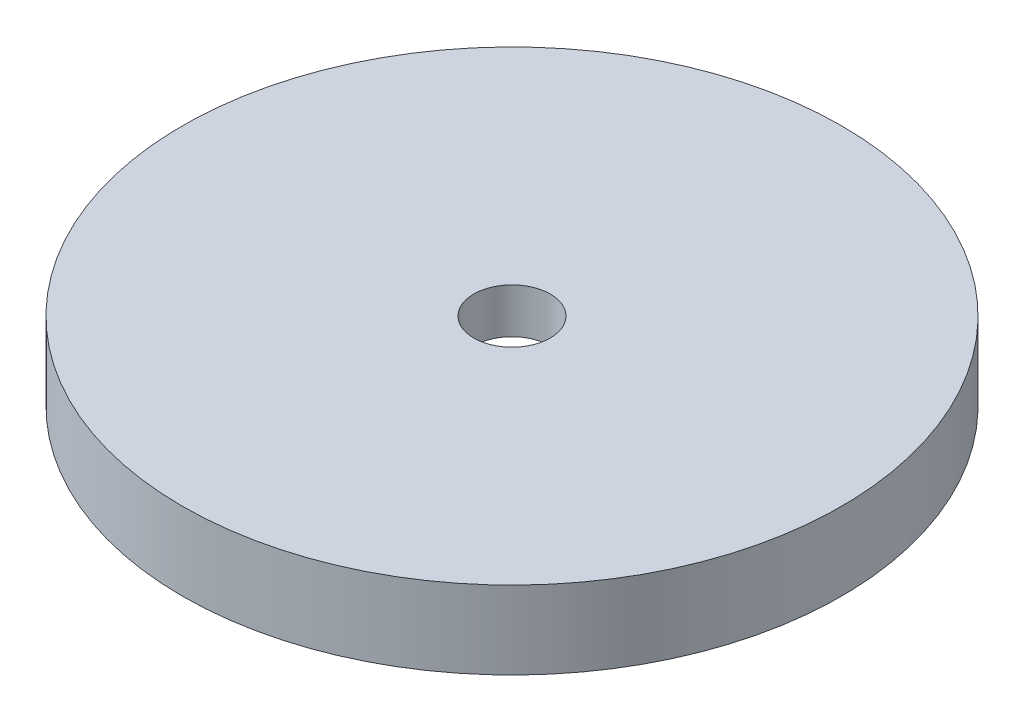
ISO-10303-21;
HEADER;
FILE_DESCRIPTION(('STEP AP214'),'2;1');
FILE_NAME('part.step','',(''),(''),'','','');
FILE_SCHEMA(('AUTOMOTIVE_DESIGN { 1 0 10303 214 1 1 1 1 }'));
ENDSEC;
DATA;
#1=APPLICATION_CONTEXT('core data for automotive mechanical design processes');
#2=APPLICATION_PROTOCOL_DEFINITION('international standard','automotive_design',2000,#1);
#3=PRODUCT_CONTEXT('',#1,'mechanical');
#4=PRODUCT('Part','Part','',(#3));
#5=PRODUCT_RELATED_PRODUCT_CATEGORY('part','',(#4));
#6=PRODUCT_DEFINITION_FORMATION('','',#4);
#7=PRODUCT_DEFINITION_CONTEXT('part definition',#1,'design');
#8=PRODUCT_DEFINITION('design','',#6,#7);
#9=PRODUCT_DEFINITION_SHAPE('','',#8);
#10=(LENGTH_UNIT() NAMED_UNIT(*) SI_UNIT(.MILLI.,.METRE.));
#11=(NAMED_UNIT(*) PLANE_ANGLE_UNIT() SI_UNIT($,.RADIAN.));
#12=(NAMED_UNIT(*) SI_UNIT($,.STERADIAN.) SOLID_ANGLE_UNIT());
#13=UNCERTAINTY_MEASURE_WITH_UNIT(LENGTH_MEASURE(1.E-05),#10,'distance_accuracy_value','');
#14=(GEOMETRIC_REPRESENTATION_CONTEXT(3) GLOBAL_UNCERTAINTY_ASSIGNED_CONTEXT((#13)) GLOBAL_UNIT_ASSIGNED_CONTEXT((#10,
#11,#12)) REPRESENTATION_CONTEXT('',''));
#15=CARTESIAN_POINT('',(0.,0.,0.));
#16=DIRECTION('',(0.,0.,1.));
#17=DIRECTION('',(1.,0.,0.));
#18=AXIS2_PLACEMENT_3D('',#15,#16,#17);
#19=CARTESIAN_POINT('',(0.,5.2,0.));
#20=DIRECTION('',(0.,-1.,0.));
#21=DIRECTION('',(0.,0.,-1.));
#22=AXIS2_PLACEMENT_3D('',#19,#20,#21);
#23=CYLINDRICAL_SURFACE('',#22,2.55);
#24=CARTESIAN_POINT('',(0.,5.2,0.));
#25=DIRECTION('',(0.,1.,0.));
#26=DIRECTION('',(0.,0.,1.));
#27=AXIS2_PLACEMENT_3D('',#24,#25,#26);
#28=CIRCLE('',#27,2.55);
#29=CARTESIAN_POINT('',(0.,5.2,2.55));
#30=VERTEX_POINT('',#29);
#31=EDGE_CURVE('E61',#30,#30,#28,.T.);
#32=ORIENTED_EDGE('',*,*,#31,.T.);
#33=EDGE_LOOP('',(#32));
#34=FACE_BOUND('',#33,.T.);
#35=CARTESIAN_POINT('',(0.,2.2,0.));
#36=DIRECTION('',(0.,-1.,0.));
#37=DIRECTION('',(0.,0.,-1.));
#38=AXIS2_PLACEMENT_3D('',#35,#36,#37);
#39=CIRCLE('',#38,2.55);
#40=CARTESIAN_POINT('',(0.,2.2,-2.55));
#41=VERTEX_POINT('',#40);
#42=EDGE_CURVE('E52',#41,#41,#39,.T.);
#43=ORIENTED_EDGE('',*,*,#42,.T.);
#44=EDGE_LOOP('',(#43));
#45=FACE_BOUND('',#44,.T.);
#46=ADVANCED_FACE('F48',(#34,#45),#23,.F.);
#47=CARTESIAN_POINT('',(0.,5.2,0.));
#48=DIRECTION('',(0.,1.,0.));
#49=DIRECTION('',(0.,0.,1.));
#50=AXIS2_PLACEMENT_3D('',#47,#48,#49);
#51=PLANE('',#50);
#52=CARTESIAN_POINT('',(0.,5.2,0.));
#53=DIRECTION('',(0.,1.,0.));
#54=DIRECTION('',(0.,0.,1.));
#55=AXIS2_PLACEMENT_3D('',#52,#53,#54);
#56=CIRCLE('',#55,22.);
#57=CARTESIAN_POINT('',(0.,5.2,22.));
#58=VERTEX_POINT('',#57);
#59=EDGE_CURVE('E12',#58,#58,#56,.T.);
#60=ORIENTED_EDGE('',*,*,#59,.T.);
#61=EDGE_LOOP('',(#60));
#62=FACE_BOUND('',#61,.T.);
#63=ORIENTED_EDGE('',*,*,#31,.F.);
#64=EDGE_LOOP('',(#63));
#65=FACE_BOUND('',#64,.T.);
#66=ADVANCED_FACE('F86',(#62,#65),#51,.T.);
#67=CARTESIAN_POINT('',(0.,0.,0.));
#68=DIRECTION('',(0.,1.,0.));
#69=DIRECTION('',(0.,0.,1.));
#70=AXIS2_PLACEMENT_3D('',#67,#68,#69);
#71=PLANE('',#70);
#72=CARTESIAN_POINT('',(0.,0.,0.));
#73=DIRECTION('',(0.,-1.,0.));
#74=DIRECTION('',(0.,0.,-1.));
#75=AXIS2_PLACEMENT_3D('',#72,#73,#74);
#76=CIRCLE('',#75,21.);
#77=CARTESIAN_POINT('',(0.,0.,-21.));
#78=VERTEX_POINT('',#77);
#79=EDGE_CURVE('E65',#78,#78,#76,.T.);
#80=ORIENTED_EDGE('',*,*,#79,.F.);
#81=EDGE_LOOP('',(#80));
#82=FACE_BOUND('',#81,.T.);
#83=CARTESIAN_POINT('',(0.,0.,0.));
#84=DIRECTION('',(0.,1.,0.));
#85=DIRECTION('',(0.,0.,1.));
#86=AXIS2_PLACEMENT_3D('',#83,#84,#85);
#87=CIRCLE('',#86,22.);
#88=CARTESIAN_POINT('',(0.,0.,22.));
#89=VERTEX_POINT('',#88);
#90=EDGE_CURVE('E56',#89,#89,#87,.T.);
#91=ORIENTED_EDGE('',*,*,#90,.F.);
#92=EDGE_LOOP('',(#91));
#93=FACE_BOUND('',#92,.T.);
#94=ADVANCED_FACE('F92',(#82,#93),#71,.F.);
#95=CARTESIAN_POINT('',(0.,5.2,0.));
#96=DIRECTION('',(0.,-1.,0.));
#97=DIRECTION('',(0.,0.,-1.));
#98=AXIS2_PLACEMENT_3D('',#95,#96,#97);
#99=CYLINDRICAL_SURFACE('',#98,22.);
#100=ORIENTED_EDGE('',*,*,#59,.F.);
#101=EDGE_LOOP('',(#100));
#102=FACE_BOUND('',#101,.T.);
#103=ORIENTED_EDGE('',*,*,#90,.T.);
#104=EDGE_LOOP('',(#103));
#105=FACE_BOUND('',#104,.T.);
#106=ADVANCED_FACE('F50',(#102,#105),#99,.T.);
#107=CARTESIAN_POINT('',(0.,2.2,0.));
#108=DIRECTION('',(0.,-1.,0.));
#109=DIRECTION('',(0.,0.,-1.));
#110=AXIS2_PLACEMENT_3D('',#107,#108,#109);
#111=CYLINDRICAL_SURFACE('',#110,21.);
#112=CARTESIAN_POINT('',(0.,2.2,0.));
#113=DIRECTION('',(0.,-1.,0.));
#114=DIRECTION('',(0.,0.,-1.));
#115=AXIS2_PLACEMENT_3D('',#112,#113,#114);
#116=CIRCLE('',#115,21.);
#117=CARTESIAN_POINT('',(0.,2.2,-21.));
#118=VERTEX_POINT('',#117);
#119=EDGE_CURVE('E68',#118,#118,#116,.T.);
#120=ORIENTED_EDGE('',*,*,#119,.F.);
#121=EDGE_LOOP('',(#120));
#122=FACE_BOUND('',#121,.T.);
#123=ORIENTED_EDGE('',*,*,#79,.T.);
#124=EDGE_LOOP('',(#123));
#125=FACE_BOUND('',#124,.T.);
#126=ADVANCED_FACE('F78',(#122,#125),#111,.F.);
#127=CARTESIAN_POINT('',(0.,2.2,0.));
#128=DIRECTION('',(0.,-1.,0.));
#129=DIRECTION('',(0.,0.,-1.));
#130=AXIS2_PLACEMENT_3D('',#127,#128,#129);
#131=PLANE('',#130);
#132=ORIENTED_EDGE('',*,*,#42,.F.);
#133=EDGE_LOOP('',(#132));
#134=FACE_BOUND('',#133,.T.);
#135=ORIENTED_EDGE('',*,*,#119,.T.);
#136=EDGE_LOOP('',(#135));
#137=FACE_BOUND('',#136,.T.);
#138=ADVANCED_FACE('F76',(#134,#137),#131,.T.);
#139=CLOSED_SHELL('',(#46,#66,#94,#106,#126,#138));
#140=MANIFOLD_SOLID_BREP('B2',#139);
#141=ADVANCED_BREP_SHAPE_REPRESENTATION('',(#18,#140),#14);
#142=SHAPE_DEFINITION_REPRESENTATION(#9,#141);
ENDSEC;
END-ISO-10303-21;
